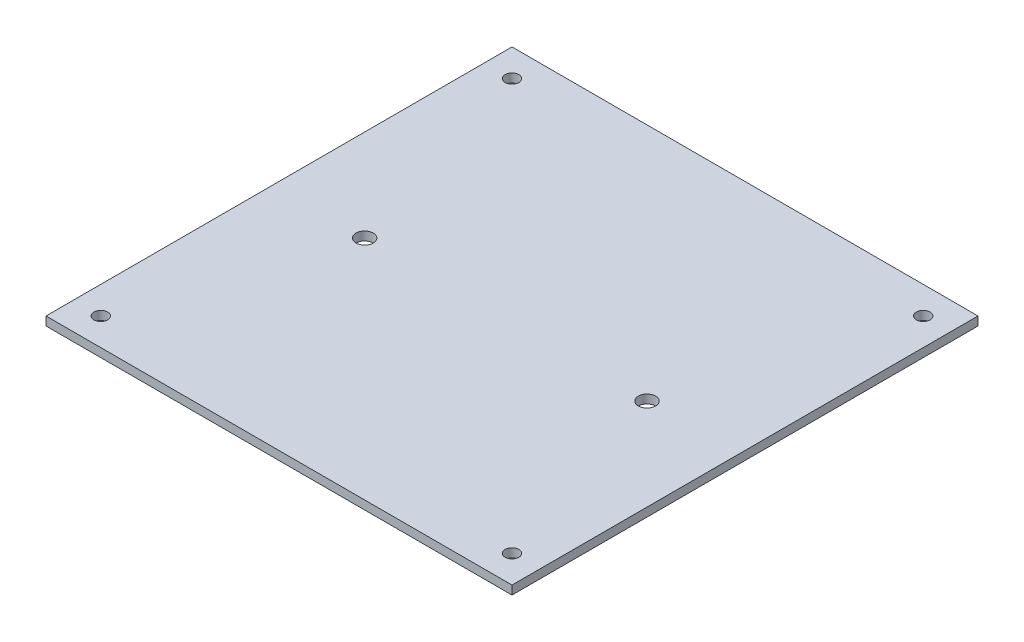
ISO-10303-21;
HEADER;
FILE_DESCRIPTION(('STEP AP214'),'2;1');
FILE_NAME('part.step','',(''),(''),'','','');
FILE_SCHEMA(('AUTOMOTIVE_DESIGN { 1 0 10303 214 1 1 1 1 }'));
ENDSEC;
DATA;
#1=APPLICATION_CONTEXT('core data for automotive mechanical design processes');
#2=APPLICATION_PROTOCOL_DEFINITION('international standard','automotive_design',2000,#1);
#3=PRODUCT_CONTEXT('',#1,'mechanical');
#4=PRODUCT('Part','Part','',(#3));
#5=PRODUCT_RELATED_PRODUCT_CATEGORY('part','',(#4));
#6=PRODUCT_DEFINITION_FORMATION('','',#4);
#7=PRODUCT_DEFINITION_CONTEXT('part definition',#1,'design');
#8=PRODUCT_DEFINITION('design','',#6,#7);
#9=PRODUCT_DEFINITION_SHAPE('','',#8);
#10=(LENGTH_UNIT() NAMED_UNIT(*) SI_UNIT(.MILLI.,.METRE.));
#11=(NAMED_UNIT(*) PLANE_ANGLE_UNIT() SI_UNIT($,.RADIAN.));
#12=(NAMED_UNIT(*) SI_UNIT($,.STERADIAN.) SOLID_ANGLE_UNIT());
#13=UNCERTAINTY_MEASURE_WITH_UNIT(LENGTH_MEASURE(1.E-05),#10,'distance_accuracy_value','');
#14=(GEOMETRIC_REPRESENTATION_CONTEXT(3) GLOBAL_UNCERTAINTY_ASSIGNED_CONTEXT((#13)) GLOBAL_UNIT_ASSIGNED_CONTEXT((#10,
#11,#12)) REPRESENTATION_CONTEXT('',''));
#15=CARTESIAN_POINT('',(0.,0.,0.));
#16=DIRECTION('',(0.,0.,1.));
#17=DIRECTION('',(1.,0.,0.));
#18=AXIS2_PLACEMENT_3D('',#15,#16,#17);
#19=CARTESIAN_POINT('',(0.,3.175,85.));
#20=DIRECTION('',(0.,0.,-1.));
#21=DIRECTION('',(-1.,0.,0.));
#22=AXIS2_PLACEMENT_3D('',#19,#20,#21);
#23=PLANE('',#22);
#24=DIRECTION('',(1.,0.,0.));
#25=VECTOR('',#24,1.);
#26=CARTESIAN_POINT('',(0.,0.,85.));
#27=LINE('',#26,#25);
#28=CARTESIAN_POINT('',(-85.,0.,85.));
#29=VERTEX_POINT('',#28);
#30=CARTESIAN_POINT('',(85.,0.,85.));
#31=VERTEX_POINT('',#30);
#32=EDGE_CURVE('E131',#29,#31,#27,.T.);
#33=ORIENTED_EDGE('',*,*,#32,.T.);
#34=DIRECTION('',(0.,-1.,0.));
#35=VECTOR('',#34,1.);
#36=CARTESIAN_POINT('',(85.,3.175,85.));
#37=LINE('',#36,#35);
#38=CARTESIAN_POINT('',(85.,3.175,85.));
#39=VERTEX_POINT('',#38);
#40=EDGE_CURVE('E11',#39,#31,#37,.T.);
#41=ORIENTED_EDGE('',*,*,#40,.F.);
#42=DIRECTION('',(1.,0.,0.));
#43=VECTOR('',#42,1.);
#44=CARTESIAN_POINT('',(0.,3.175,85.));
#45=LINE('',#44,#43);
#46=CARTESIAN_POINT('',(-85.,3.175,85.));
#47=VERTEX_POINT('',#46);
#48=EDGE_CURVE('E105',#47,#39,#45,.T.);
#49=ORIENTED_EDGE('',*,*,#48,.F.);
#50=DIRECTION('',(0.,-1.,0.));
#51=VECTOR('',#50,1.);
#52=CARTESIAN_POINT('',(-85.,3.175,85.));
#53=LINE('',#52,#51);
#54=EDGE_CURVE('E69',#47,#29,#53,.T.);
#55=ORIENTED_EDGE('',*,*,#54,.T.);
#56=EDGE_LOOP('',(#33,#41,#49,#55));
#57=FACE_BOUND('',#56,.T.);
#58=ADVANCED_FACE('F51',(#57),#23,.F.);
#59=CARTESIAN_POINT('',(85.,3.175,0.));
#60=DIRECTION('',(-1.,0.,0.));
#61=DIRECTION('',(0.,0.,1.));
#62=AXIS2_PLACEMENT_3D('',#59,#60,#61);
#63=PLANE('',#62);
#64=DIRECTION('',(0.,0.,-1.));
#65=VECTOR('',#64,1.);
#66=CARTESIAN_POINT('',(85.,0.,0.));
#67=LINE('',#66,#65);
#68=CARTESIAN_POINT('',(85.,0.,-85.));
#69=VERTEX_POINT('',#68);
#70=EDGE_CURVE('E110',#31,#69,#67,.T.);
#71=ORIENTED_EDGE('',*,*,#70,.T.);
#72=DIRECTION('',(0.,-1.,0.));
#73=VECTOR('',#72,1.);
#74=CARTESIAN_POINT('',(85.,3.175,-85.));
#75=LINE('',#74,#73);
#76=CARTESIAN_POINT('',(85.,3.175,-85.));
#77=VERTEX_POINT('',#76);
#78=EDGE_CURVE('E58',#77,#69,#75,.T.);
#79=ORIENTED_EDGE('',*,*,#78,.F.);
#80=DIRECTION('',(0.,0.,-1.));
#81=VECTOR('',#80,1.);
#82=CARTESIAN_POINT('',(85.,3.175,0.));
#83=LINE('',#82,#81);
#84=EDGE_CURVE('E91',#39,#77,#83,.T.);
#85=ORIENTED_EDGE('',*,*,#84,.F.);
#86=ORIENTED_EDGE('',*,*,#40,.T.);
#87=EDGE_LOOP('',(#71,#79,#85,#86));
#88=FACE_BOUND('',#87,.T.);
#89=ADVANCED_FACE('F106',(#88),#63,.F.);
#90=CARTESIAN_POINT('',(0.,3.175,-85.));
#91=DIRECTION('',(0.,0.,-1.));
#92=DIRECTION('',(-1.,0.,0.));
#93=AXIS2_PLACEMENT_3D('',#90,#91,#92);
#94=PLANE('',#93);
#95=DIRECTION('',(1.,0.,0.));
#96=VECTOR('',#95,1.);
#97=CARTESIAN_POINT('',(0.,0.,-85.));
#98=LINE('',#97,#96);
#99=CARTESIAN_POINT('',(-85.,0.,-85.));
#100=VERTEX_POINT('',#99);
#101=EDGE_CURVE('E140',#100,#69,#98,.T.);
#102=ORIENTED_EDGE('',*,*,#101,.F.);
#103=DIRECTION('',(0.,-1.,0.));
#104=VECTOR('',#103,1.);
#105=CARTESIAN_POINT('',(-85.,3.175,-85.));
#106=LINE('',#105,#104);
#107=CARTESIAN_POINT('',(-85.,3.175,-85.));
#108=VERTEX_POINT('',#107);
#109=EDGE_CURVE('E85',#108,#100,#106,.T.);
#110=ORIENTED_EDGE('',*,*,#109,.F.);
#111=DIRECTION('',(1.,0.,0.));
#112=VECTOR('',#111,1.);
#113=CARTESIAN_POINT('',(0.,3.175,-85.));
#114=LINE('',#113,#112);
#115=EDGE_CURVE('E101',#108,#77,#114,.T.);
#116=ORIENTED_EDGE('',*,*,#115,.T.);
#117=ORIENTED_EDGE('',*,*,#78,.T.);
#118=EDGE_LOOP('',(#102,#110,#116,#117));
#119=FACE_BOUND('',#118,.T.);
#120=ADVANCED_FACE('F109',(#119),#94,.T.);
#121=CARTESIAN_POINT('',(-85.,3.175,0.));
#122=DIRECTION('',(-1.,0.,0.));
#123=DIRECTION('',(0.,0.,1.));
#124=AXIS2_PLACEMENT_3D('',#121,#122,#123);
#125=PLANE('',#124);
#126=DIRECTION('',(0.,0.,-1.));
#127=VECTOR('',#126,1.);
#128=CARTESIAN_POINT('',(-85.,0.,0.));
#129=LINE('',#128,#127);
#130=EDGE_CURVE('E136',#29,#100,#129,.T.);
#131=ORIENTED_EDGE('',*,*,#130,.F.);
#132=ORIENTED_EDGE('',*,*,#54,.F.);
#133=DIRECTION('',(0.,0.,-1.));
#134=VECTOR('',#133,1.);
#135=CARTESIAN_POINT('',(-85.,3.175,0.));
#136=LINE('',#135,#134);
#137=EDGE_CURVE('E112',#47,#108,#136,.T.);
#138=ORIENTED_EDGE('',*,*,#137,.T.);
#139=ORIENTED_EDGE('',*,*,#109,.T.);
#140=EDGE_LOOP('',(#131,#132,#138,#139));
#141=FACE_BOUND('',#140,.T.);
#142=ADVANCED_FACE('F198',(#141),#125,.T.);
#143=CARTESIAN_POINT('',(-75.,3.175,-75.));
#144=DIRECTION('',(0.,-1.,0.));
#145=DIRECTION('',(0.,0.,-1.));
#146=AXIS2_PLACEMENT_3D('',#143,#144,#145);
#147=CYLINDRICAL_SURFACE('',#146,2.50000000000001);
#148=CARTESIAN_POINT('',(-75.,3.175,-75.));
#149=DIRECTION('',(0.,1.,0.));
#150=DIRECTION('',(0.,0.,1.));
#151=AXIS2_PLACEMENT_3D('',#148,#149,#150);
#152=CIRCLE('',#151,2.50000000000001);
#153=CARTESIAN_POINT('',(-75.,3.175,-72.5));
#154=VERTEX_POINT('',#153);
#155=EDGE_CURVE('E162',#154,#154,#152,.T.);
#156=ORIENTED_EDGE('',*,*,#155,.T.);
#157=EDGE_LOOP('',(#156));
#158=FACE_BOUND('',#157,.T.);
#159=CARTESIAN_POINT('',(-75.,0.,-75.));
#160=DIRECTION('',(0.,1.,0.));
#161=DIRECTION('',(0.,0.,1.));
#162=AXIS2_PLACEMENT_3D('',#159,#160,#161);
#163=CIRCLE('',#162,2.50000000000001);
#164=CARTESIAN_POINT('',(-75.,0.,-72.5));
#165=VERTEX_POINT('',#164);
#166=EDGE_CURVE('E132',#165,#165,#163,.T.);
#167=ORIENTED_EDGE('',*,*,#166,.F.);
#168=EDGE_LOOP('',(#167));
#169=FACE_BOUND('',#168,.T.);
#170=ADVANCED_FACE('F170',(#158,#169),#147,.F.);
#171=CARTESIAN_POINT('',(75.,3.175,-75.));
#172=DIRECTION('',(0.,-1.,0.));
#173=DIRECTION('',(0.,0.,-1.));
#174=AXIS2_PLACEMENT_3D('',#171,#172,#173);
#175=CYLINDRICAL_SURFACE('',#174,2.5);
#176=CARTESIAN_POINT('',(75.,3.175,-75.));
#177=DIRECTION('',(0.,1.,0.));
#178=DIRECTION('',(0.,0.,1.));
#179=AXIS2_PLACEMENT_3D('',#176,#177,#178);
#180=CIRCLE('',#179,2.5);
#181=CARTESIAN_POINT('',(75.,3.175,-72.5));
#182=VERTEX_POINT('',#181);
#183=EDGE_CURVE('E159',#182,#182,#180,.T.);
#184=ORIENTED_EDGE('',*,*,#183,.T.);
#185=EDGE_LOOP('',(#184));
#186=FACE_BOUND('',#185,.T.);
#187=CARTESIAN_POINT('',(75.,0.,-75.));
#188=DIRECTION('',(0.,1.,0.));
#189=DIRECTION('',(0.,0.,1.));
#190=AXIS2_PLACEMENT_3D('',#187,#188,#189);
#191=CIRCLE('',#190,2.5);
#192=CARTESIAN_POINT('',(75.,0.,-72.5));
#193=VERTEX_POINT('',#192);
#194=EDGE_CURVE('E126',#193,#193,#191,.T.);
#195=ORIENTED_EDGE('',*,*,#194,.F.);
#196=EDGE_LOOP('',(#195));
#197=FACE_BOUND('',#196,.T.);
#198=ADVANCED_FACE('F193',(#186,#197),#175,.F.);
#199=CARTESIAN_POINT('',(75.,3.175,75.));
#200=DIRECTION('',(0.,-1.,0.));
#201=DIRECTION('',(0.,0.,-1.));
#202=AXIS2_PLACEMENT_3D('',#199,#200,#201);
#203=CYLINDRICAL_SURFACE('',#202,2.5);
#204=CARTESIAN_POINT('',(75.,3.175,75.));
#205=DIRECTION('',(0.,1.,0.));
#206=DIRECTION('',(0.,0.,1.));
#207=AXIS2_PLACEMENT_3D('',#204,#205,#206);
#208=CIRCLE('',#207,2.5);
#209=CARTESIAN_POINT('',(75.,3.175,77.5));
#210=VERTEX_POINT('',#209);
#211=EDGE_CURVE('E154',#210,#210,#208,.F.);
#212=ORIENTED_EDGE('',*,*,#211,.F.);
#213=EDGE_LOOP('',(#212));
#214=FACE_BOUND('',#213,.T.);
#215=CARTESIAN_POINT('',(75.,0.,75.));
#216=DIRECTION('',(0.,1.,0.));
#217=DIRECTION('',(0.,0.,1.));
#218=AXIS2_PLACEMENT_3D('',#215,#216,#217);
#219=CIRCLE('',#218,2.5);
#220=CARTESIAN_POINT('',(75.,0.,77.5));
#221=VERTEX_POINT('',#220);
#222=EDGE_CURVE('E123',#221,#221,#219,.F.);
#223=ORIENTED_EDGE('',*,*,#222,.T.);
#224=EDGE_LOOP('',(#223));
#225=FACE_BOUND('',#224,.T.);
#226=ADVANCED_FACE('F200',(#214,#225),#203,.F.);
#227=CARTESIAN_POINT('',(-51.5,3.175,2.24999999999999));
#228=DIRECTION('',(0.,-1.,0.));
#229=DIRECTION('',(0.,0.,-1.));
#230=AXIS2_PLACEMENT_3D('',#227,#228,#229);
#231=CYLINDRICAL_SURFACE('',#230,3.15);
#232=CARTESIAN_POINT('',(-51.5,3.175,2.24999999999999));
#233=DIRECTION('',(0.,1.,0.));
#234=DIRECTION('',(0.,0.,1.));
#235=AXIS2_PLACEMENT_3D('',#232,#233,#234);
#236=CIRCLE('',#235,3.15);
#237=CARTESIAN_POINT('',(-51.5,3.175,5.39999999999999));
#238=VERTEX_POINT('',#237);
#239=EDGE_CURVE('E147',#238,#238,#236,.T.);
#240=ORIENTED_EDGE('',*,*,#239,.T.);
#241=EDGE_LOOP('',(#240));
#242=FACE_BOUND('',#241,.T.);
#243=CARTESIAN_POINT('',(-51.5,0.,2.24999999999999));
#244=DIRECTION('',(0.,1.,0.));
#245=DIRECTION('',(0.,0.,1.));
#246=AXIS2_PLACEMENT_3D('',#243,#244,#245);
#247=CIRCLE('',#246,3.15);
#248=CARTESIAN_POINT('',(-51.5,0.,5.39999999999999));
#249=VERTEX_POINT('',#248);
#250=EDGE_CURVE('E125',#249,#249,#247,.T.);
#251=ORIENTED_EDGE('',*,*,#250,.F.);
#252=EDGE_LOOP('',(#251));
#253=FACE_BOUND('',#252,.T.);
#254=ADVANCED_FACE('F205',(#242,#253),#231,.F.);
#255=CARTESIAN_POINT('',(51.5,3.175,2.24999999999999));
#256=DIRECTION('',(0.,-1.,0.));
#257=DIRECTION('',(0.,0.,-1.));
#258=AXIS2_PLACEMENT_3D('',#255,#256,#257);
#259=CYLINDRICAL_SURFACE('',#258,3.15);
#260=CARTESIAN_POINT('',(51.5,3.175,2.24999999999999));
#261=DIRECTION('',(0.,1.,0.));
#262=DIRECTION('',(0.,0.,1.));
#263=AXIS2_PLACEMENT_3D('',#260,#261,#262);
#264=CIRCLE('',#263,3.15);
#265=CARTESIAN_POINT('',(51.5,3.175,5.39999999999999));
#266=VERTEX_POINT('',#265);
#267=EDGE_CURVE('E144',#266,#266,#264,.T.);
#268=ORIENTED_EDGE('',*,*,#267,.T.);
#269=EDGE_LOOP('',(#268));
#270=FACE_BOUND('',#269,.T.);
#271=CARTESIAN_POINT('',(51.5,0.,2.24999999999999));
#272=DIRECTION('',(0.,1.,0.));
#273=DIRECTION('',(0.,0.,1.));
#274=AXIS2_PLACEMENT_3D('',#271,#272,#273);
#275=CIRCLE('',#274,3.15);
#276=CARTESIAN_POINT('',(51.5,0.,5.39999999999999));
#277=VERTEX_POINT('',#276);
#278=EDGE_CURVE('E116',#277,#277,#275,.T.);
#279=ORIENTED_EDGE('',*,*,#278,.F.);
#280=EDGE_LOOP('',(#279));
#281=FACE_BOUND('',#280,.T.);
#282=ADVANCED_FACE('F52',(#270,#281),#259,.F.);
#283=CARTESIAN_POINT('',(-75.,3.175,75.));
#284=DIRECTION('',(0.,-1.,0.));
#285=DIRECTION('',(0.,0.,-1.));
#286=AXIS2_PLACEMENT_3D('',#283,#284,#285);
#287=CYLINDRICAL_SURFACE('',#286,2.50000000000001);
#288=CARTESIAN_POINT('',(-75.,3.175,75.));
#289=DIRECTION('',(0.,1.,0.));
#290=DIRECTION('',(0.,0.,1.));
#291=AXIS2_PLACEMENT_3D('',#288,#289,#290);
#292=CIRCLE('',#291,2.50000000000001);
#293=CARTESIAN_POINT('',(-75.,3.175,77.5));
#294=VERTEX_POINT('',#293);
#295=EDGE_CURVE('E114',#294,#294,#292,.F.);
#296=ORIENTED_EDGE('',*,*,#295,.F.);
#297=EDGE_LOOP('',(#296));
#298=FACE_BOUND('',#297,.T.);
#299=CARTESIAN_POINT('',(-75.,0.,75.));
#300=DIRECTION('',(0.,1.,0.));
#301=DIRECTION('',(0.,0.,1.));
#302=AXIS2_PLACEMENT_3D('',#299,#300,#301);
#303=CIRCLE('',#302,2.50000000000001);
#304=CARTESIAN_POINT('',(-75.,0.,77.5));
#305=VERTEX_POINT('',#304);
#306=EDGE_CURVE('E142',#305,#305,#303,.F.);
#307=ORIENTED_EDGE('',*,*,#306,.T.);
#308=EDGE_LOOP('',(#307));
#309=FACE_BOUND('',#308,.T.);
#310=ADVANCED_FACE('F175',(#298,#309),#287,.F.);
#311=CARTESIAN_POINT('',(0.,3.175,0.));
#312=DIRECTION('',(0.,1.,0.));
#313=DIRECTION('',(0.,0.,1.));
#314=AXIS2_PLACEMENT_3D('',#311,#312,#313);
#315=PLANE('',#314);
#316=ORIENTED_EDGE('',*,*,#267,.F.);
#317=EDGE_LOOP('',(#316));
#318=FACE_BOUND('',#317,.T.);
#319=ORIENTED_EDGE('',*,*,#239,.F.);
#320=EDGE_LOOP('',(#319));
#321=FACE_BOUND('',#320,.T.);
#322=ORIENTED_EDGE('',*,*,#211,.T.);
#323=EDGE_LOOP('',(#322));
#324=FACE_BOUND('',#323,.T.);
#325=ORIENTED_EDGE('',*,*,#183,.F.);
#326=EDGE_LOOP('',(#325));
#327=FACE_BOUND('',#326,.T.);
#328=ORIENTED_EDGE('',*,*,#155,.F.);
#329=EDGE_LOOP('',(#328));
#330=FACE_BOUND('',#329,.T.);
#331=ORIENTED_EDGE('',*,*,#48,.T.);
#332=ORIENTED_EDGE('',*,*,#84,.T.);
#333=ORIENTED_EDGE('',*,*,#115,.F.);
#334=ORIENTED_EDGE('',*,*,#137,.F.);
#335=EDGE_LOOP('',(#331,#332,#333,#334));
#336=FACE_BOUND('',#335,.T.);
#337=ORIENTED_EDGE('',*,*,#295,.T.);
#338=EDGE_LOOP('',(#337));
#339=FACE_BOUND('',#338,.T.);
#340=ADVANCED_FACE('F100',(#318,#321,#324,#327,#330,#336,#339),#315,.T.);
#341=CARTESIAN_POINT('',(0.,0.,0.));
#342=DIRECTION('',(0.,1.,0.));
#343=DIRECTION('',(0.,0.,1.));
#344=AXIS2_PLACEMENT_3D('',#341,#342,#343);
#345=PLANE('',#344);
#346=ORIENTED_EDGE('',*,*,#278,.T.);
#347=EDGE_LOOP('',(#346));
#348=FACE_BOUND('',#347,.T.);
#349=ORIENTED_EDGE('',*,*,#250,.T.);
#350=EDGE_LOOP('',(#349));
#351=FACE_BOUND('',#350,.T.);
#352=ORIENTED_EDGE('',*,*,#222,.F.);
#353=EDGE_LOOP('',(#352));
#354=FACE_BOUND('',#353,.T.);
#355=ORIENTED_EDGE('',*,*,#194,.T.);
#356=EDGE_LOOP('',(#355));
#357=FACE_BOUND('',#356,.T.);
#358=ORIENTED_EDGE('',*,*,#166,.T.);
#359=EDGE_LOOP('',(#358));
#360=FACE_BOUND('',#359,.T.);
#361=ORIENTED_EDGE('',*,*,#32,.F.);
#362=ORIENTED_EDGE('',*,*,#130,.T.);
#363=ORIENTED_EDGE('',*,*,#101,.T.);
#364=ORIENTED_EDGE('',*,*,#70,.F.);
#365=EDGE_LOOP('',(#361,#362,#363,#364));
#366=FACE_BOUND('',#365,.T.);
#367=ORIENTED_EDGE('',*,*,#306,.F.);
#368=EDGE_LOOP('',(#367));
#369=FACE_BOUND('',#368,.T.);
#370=ADVANCED_FACE('F172',(#348,#351,#354,#357,#360,#366,#369),#345,.F.);
#371=CLOSED_SHELL('',(#58,#89,#120,#142,#170,#198,#226,#254,#282,#310,#340,#370));
#372=MANIFOLD_SOLID_BREP('B2',#371);
#373=ADVANCED_BREP_SHAPE_REPRESENTATION('',(#18,#372),#14);
#374=SHAPE_DEFINITION_REPRESENTATION(#9,#373);
ENDSEC;
END-ISO-10303-21;
